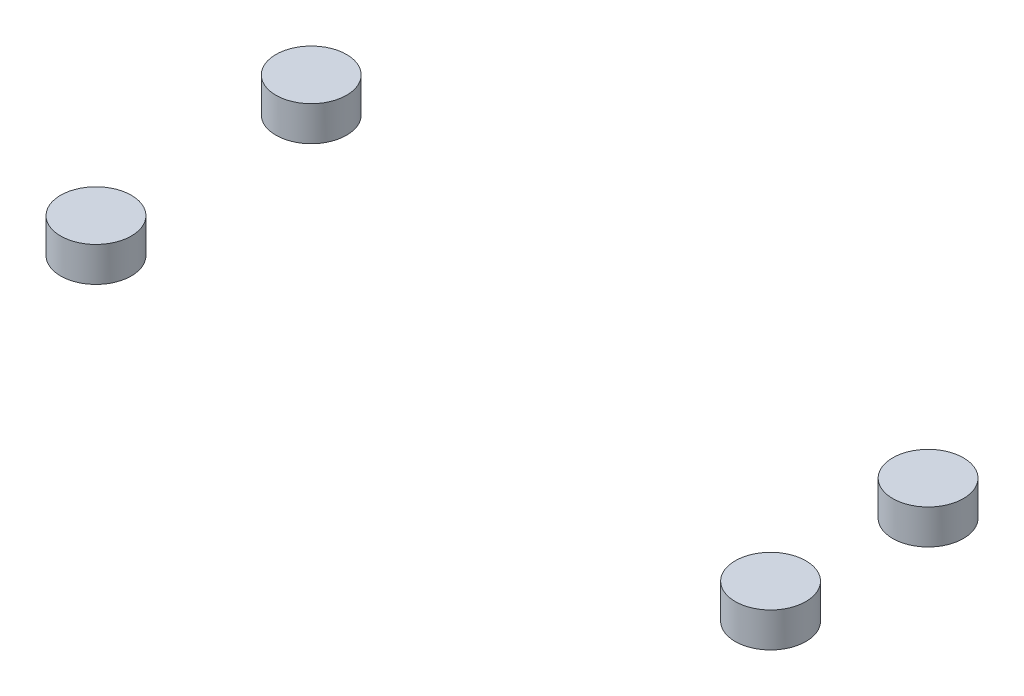
ISO-10303-21;
HEADER;
FILE_DESCRIPTION(('STEP AP214'),'2;1');
FILE_NAME('part.step','',(''),(''),'','','');
FILE_SCHEMA(('AUTOMOTIVE_DESIGN { 1 0 10303 214 1 1 1 1 }'));
ENDSEC;
DATA;
#1=APPLICATION_CONTEXT('core data for automotive mechanical design processes');
#2=APPLICATION_PROTOCOL_DEFINITION('international standard','automotive_design',2000,#1);
#3=PRODUCT_CONTEXT('',#1,'mechanical');
#4=PRODUCT('Part','Part','',(#3));
#5=PRODUCT_RELATED_PRODUCT_CATEGORY('part','',(#4));
#6=PRODUCT_DEFINITION_FORMATION('','',#4);
#7=PRODUCT_DEFINITION_CONTEXT('part definition',#1,'design');
#8=PRODUCT_DEFINITION('design','',#6,#7);
#9=PRODUCT_DEFINITION_SHAPE('','',#8);
#10=(LENGTH_UNIT() NAMED_UNIT(*) SI_UNIT(.MILLI.,.METRE.));
#11=(NAMED_UNIT(*) PLANE_ANGLE_UNIT() SI_UNIT($,.RADIAN.));
#12=(NAMED_UNIT(*) SI_UNIT($,.STERADIAN.) SOLID_ANGLE_UNIT());
#13=UNCERTAINTY_MEASURE_WITH_UNIT(LENGTH_MEASURE(1.E-05),#10,'distance_accuracy_value','');
#14=(GEOMETRIC_REPRESENTATION_CONTEXT(3) GLOBAL_UNCERTAINTY_ASSIGNED_CONTEXT((#13)) GLOBAL_UNIT_ASSIGNED_CONTEXT((#10,
#11,#12)) REPRESENTATION_CONTEXT('',''));
#15=CARTESIAN_POINT('',(0.,0.,0.));
#16=DIRECTION('',(0.,0.,1.));
#17=DIRECTION('',(1.,0.,0.));
#18=AXIS2_PLACEMENT_3D('',#15,#16,#17);
#19=CARTESIAN_POINT('',(-75.3231493812435,0.,20.6520537521322));
#20=DIRECTION('',(0.,1.,0.));
#21=DIRECTION('',(0.,0.,1.));
#22=AXIS2_PLACEMENT_3D('',#19,#20,#21);
#23=PLANE('',#22);
#24=CARTESIAN_POINT('',(-75.3231493812435,0.,20.6520537521322));
#25=DIRECTION('',(0.,1.,0.));
#26=DIRECTION('',(0.,0.,1.));
#27=AXIS2_PLACEMENT_3D('',#24,#25,#26);
#28=CIRCLE('',#27,8.00100000000002);
#29=CARTESIAN_POINT('',(-75.3231493812435,0.,28.6530537521322));
#30=VERTEX_POINT('',#29);
#31=EDGE_CURVE('E48',#30,#30,#28,.T.);
#32=ORIENTED_EDGE('',*,*,#31,.F.);
#33=EDGE_LOOP('',(#32));
#34=FACE_BOUND('',#33,.T.);
#35=ADVANCED_FACE('F41',(#34),#23,.F.);
#36=CARTESIAN_POINT('',(-75.3231493812435,30.4788454250945,20.6520537521322));
#37=DIRECTION('',(0.,-1.,0.));
#38=DIRECTION('',(0.,0.,-1.));
#39=AXIS2_PLACEMENT_3D('',#36,#37,#38);
#40=CYLINDRICAL_SURFACE('',#39,8.00100000000002);
#41=CARTESIAN_POINT('',(-75.3231493812435,7.84860000000016,20.6520537521322));
#42=DIRECTION('',(0.,-1.,0.));
#43=DIRECTION('',(0.,0.,-1.));
#44=AXIS2_PLACEMENT_3D('',#41,#42,#43);
#45=CIRCLE('',#44,8.00100000000002);
#46=CARTESIAN_POINT('',(-75.3231493812435,7.84860000000016,12.6510537521322));
#47=VERTEX_POINT('',#46);
#48=EDGE_CURVE('E11',#47,#47,#45,.T.);
#49=ORIENTED_EDGE('',*,*,#48,.T.);
#50=EDGE_LOOP('',(#49));
#51=FACE_BOUND('',#50,.T.);
#52=ORIENTED_EDGE('',*,*,#31,.T.);
#53=EDGE_LOOP('',(#52));
#54=FACE_BOUND('',#53,.T.);
#55=ADVANCED_FACE('F43',(#51,#54),#40,.T.);
#56=CARTESIAN_POINT('',(-75.3231493812435,7.84860000000015,20.6520537521322));
#57=DIRECTION('',(0.,-1.,0.));
#58=DIRECTION('',(0.0620018093914848,0.,0.998076036999277));
#59=AXIS2_PLACEMENT_3D('',#56,#57,#58);
#60=PLANE('',#59);
#61=ORIENTED_EDGE('',*,*,#48,.F.);
#62=EDGE_LOOP('',(#61));
#63=FACE_BOUND('',#62,.T.);
#64=ADVANCED_FACE('F59',(#63),#60,.F.);
#65=CLOSED_SHELL('',(#35,#55,#64));
#66=MANIFOLD_SOLID_BREP('B2',#65);
#67=CARTESIAN_POINT('',(-78.5516548533607,0.,-31.3189125578204));
#68=DIRECTION('',(0.,1.,0.));
#69=DIRECTION('',(0.,0.,1.));
#70=AXIS2_PLACEMENT_3D('',#67,#68,#69);
#71=PLANE('',#70);
#72=CARTESIAN_POINT('',(-78.5516548533607,0.,-31.3189125578204));
#73=DIRECTION('',(0.,1.,0.));
#74=DIRECTION('',(0.,0.,1.));
#75=AXIS2_PLACEMENT_3D('',#72,#73,#74);
#76=CIRCLE('',#75,8.00099999999999);
#77=CARTESIAN_POINT('',(-78.5516548533607,0.,-23.3179125578204));
#78=VERTEX_POINT('',#77);
#79=EDGE_CURVE('E96',#78,#78,#76,.T.);
#80=ORIENTED_EDGE('',*,*,#79,.F.);
#81=EDGE_LOOP('',(#80));
#82=FACE_BOUND('',#81,.T.);
#83=ADVANCED_FACE('F89',(#82),#71,.F.);
#84=CARTESIAN_POINT('',(-78.5516548533607,30.4788454250945,-31.3189125578204));
#85=DIRECTION('',(0.,-1.,0.));
#86=DIRECTION('',(0.,0.,-1.));
#87=AXIS2_PLACEMENT_3D('',#84,#85,#86);
#88=CYLINDRICAL_SURFACE('',#87,8.00099999999999);
#89=CARTESIAN_POINT('',(-78.5516548533607,7.84860000000016,-31.3189125578204));
#90=DIRECTION('',(0.,-1.,0.));
#91=DIRECTION('',(0.,0.,-1.));
#92=AXIS2_PLACEMENT_3D('',#89,#90,#91);
#93=CIRCLE('',#92,8.00099999999999);
#94=CARTESIAN_POINT('',(-78.5516548533607,7.84860000000016,-39.3199125578204));
#95=VERTEX_POINT('',#94);
#96=EDGE_CURVE('E40',#95,#95,#93,.T.);
#97=ORIENTED_EDGE('',*,*,#96,.T.);
#98=EDGE_LOOP('',(#97));
#99=FACE_BOUND('',#98,.T.);
#100=ORIENTED_EDGE('',*,*,#79,.T.);
#101=EDGE_LOOP('',(#100));
#102=FACE_BOUND('',#101,.T.);
#103=ADVANCED_FACE('F91',(#99,#102),#88,.T.);
#104=CARTESIAN_POINT('',(-75.3231493812435,7.84860000000015,20.6520537521322));
#105=DIRECTION('',(0.,-1.,0.));
#106=DIRECTION('',(0.0620018093914848,0.,0.998076036999277));
#107=AXIS2_PLACEMENT_3D('',#104,#105,#106);
#108=PLANE('',#107);
#109=ORIENTED_EDGE('',*,*,#96,.F.);
#110=EDGE_LOOP('',(#109));
#111=FACE_BOUND('',#110,.T.);
#112=ADVANCED_FACE('F107',(#111),#108,.F.);
#113=CLOSED_SHELL('',(#83,#103,#112));
#114=MANIFOLD_SOLID_BREP('B6',#113);
#115=CARTESIAN_POINT('',(72.7273490854409,0.,15.9595259459327));
#116=DIRECTION('',(0.,1.,0.));
#117=DIRECTION('',(0.,0.,1.));
#118=AXIS2_PLACEMENT_3D('',#115,#116,#117);
#119=PLANE('',#118);
#120=CARTESIAN_POINT('',(72.7273490854409,0.,15.9595259459327));
#121=DIRECTION('',(0.,1.,0.));
#122=DIRECTION('',(0.,0.,1.));
#123=AXIS2_PLACEMENT_3D('',#120,#121,#122);
#124=CIRCLE('',#123,8.00099999999997);
#125=CARTESIAN_POINT('',(72.7273490854409,0.,23.9605259459327));
#126=VERTEX_POINT('',#125);
#127=EDGE_CURVE('E145',#126,#126,#124,.T.);
#128=ORIENTED_EDGE('',*,*,#127,.F.);
#129=EDGE_LOOP('',(#128));
#130=FACE_BOUND('',#129,.T.);
#131=ADVANCED_FACE('F138',(#130),#119,.F.);
#132=CARTESIAN_POINT('',(72.7273490854409,30.4788454250945,15.9595259459327));
#133=DIRECTION('',(0.,-1.,0.));
#134=DIRECTION('',(0.,0.,-1.));
#135=AXIS2_PLACEMENT_3D('',#132,#133,#134);
#136=CYLINDRICAL_SURFACE('',#135,8.00099999999997);
#137=CARTESIAN_POINT('',(72.7273490854409,7.84860000000016,15.9595259459327));
#138=DIRECTION('',(0.,-1.,0.));
#139=DIRECTION('',(0.,0.,-1.));
#140=AXIS2_PLACEMENT_3D('',#137,#138,#139);
#141=CIRCLE('',#140,8.00099999999997);
#142=CARTESIAN_POINT('',(72.7273490854409,7.84860000000016,7.95852594593274));
#143=VERTEX_POINT('',#142);
#144=EDGE_CURVE('E88',#143,#143,#141,.T.);
#145=ORIENTED_EDGE('',*,*,#144,.T.);
#146=EDGE_LOOP('',(#145));
#147=FACE_BOUND('',#146,.T.);
#148=ORIENTED_EDGE('',*,*,#127,.T.);
#149=EDGE_LOOP('',(#148));
#150=FACE_BOUND('',#149,.T.);
#151=ADVANCED_FACE('F140',(#147,#150),#136,.T.);
#152=CARTESIAN_POINT('',(-75.3231493812435,7.84860000000015,20.6520537521322));
#153=DIRECTION('',(0.,-1.,0.));
#154=DIRECTION('',(0.0620018093914848,0.,0.998076036999277));
#155=AXIS2_PLACEMENT_3D('',#152,#153,#154);
#156=PLANE('',#155);
#157=ORIENTED_EDGE('',*,*,#144,.F.);
#158=EDGE_LOOP('',(#157));
#159=FACE_BOUND('',#158,.T.);
#160=ADVANCED_FACE('F156',(#159),#156,.F.);
#161=CLOSED_SHELL('',(#131,#151,#160));
#162=MANIFOLD_SOLID_BREP('B35',#161);
#163=CARTESIAN_POINT('',(70.3650280082865,0.,-22.0680103783486));
#164=DIRECTION('',(0.,1.,0.));
#165=DIRECTION('',(0.,0.,1.));
#166=AXIS2_PLACEMENT_3D('',#163,#164,#165);
#167=PLANE('',#166);
#168=CARTESIAN_POINT('',(70.3650280082865,0.,-22.0680103783486));
#169=DIRECTION('',(0.,1.,0.));
#170=DIRECTION('',(0.,0.,1.));
#171=AXIS2_PLACEMENT_3D('',#168,#169,#170);
#172=CIRCLE('',#171,8.00100000000002);
#173=CARTESIAN_POINT('',(70.3650280082865,0.,-14.0670103783486));
#174=VERTEX_POINT('',#173);
#175=EDGE_CURVE('E191',#174,#174,#172,.T.);
#176=ORIENTED_EDGE('',*,*,#175,.F.);
#177=EDGE_LOOP('',(#176));
#178=FACE_BOUND('',#177,.T.);
#179=ADVANCED_FACE('F184',(#178),#167,.F.);
#180=CARTESIAN_POINT('',(70.3650280082865,30.4788454250945,-22.0680103783486));
#181=DIRECTION('',(0.,-1.,0.));
#182=DIRECTION('',(0.,0.,-1.));
#183=AXIS2_PLACEMENT_3D('',#180,#181,#182);
#184=CYLINDRICAL_SURFACE('',#183,8.00100000000002);
#185=CARTESIAN_POINT('',(70.3650280082865,7.84860000000016,-22.0680103783486));
#186=DIRECTION('',(0.,-1.,0.));
#187=DIRECTION('',(0.,0.,-1.));
#188=AXIS2_PLACEMENT_3D('',#185,#186,#187);
#189=CIRCLE('',#188,8.00100000000002);
#190=CARTESIAN_POINT('',(70.3650280082865,7.84860000000016,-30.0690103783486));
#191=VERTEX_POINT('',#190);
#192=EDGE_CURVE('E137',#191,#191,#189,.T.);
#193=ORIENTED_EDGE('',*,*,#192,.T.);
#194=EDGE_LOOP('',(#193));
#195=FACE_BOUND('',#194,.T.);
#196=ORIENTED_EDGE('',*,*,#175,.T.);
#197=EDGE_LOOP('',(#196));
#198=FACE_BOUND('',#197,.T.);
#199=ADVANCED_FACE('F186',(#195,#198),#184,.T.);
#200=CARTESIAN_POINT('',(-75.3231493812435,7.84860000000015,20.6520537521322));
#201=DIRECTION('',(0.,-1.,0.));
#202=DIRECTION('',(0.0620018093914848,0.,0.998076036999277));
#203=AXIS2_PLACEMENT_3D('',#200,#201,#202);
#204=PLANE('',#203);
#205=ORIENTED_EDGE('',*,*,#192,.F.);
#206=EDGE_LOOP('',(#205));
#207=FACE_BOUND('',#206,.T.);
#208=ADVANCED_FACE('F202',(#207),#204,.F.);
#209=CLOSED_SHELL('',(#179,#199,#208));
#210=MANIFOLD_SOLID_BREP('B83',#209);
#211=ADVANCED_BREP_SHAPE_REPRESENTATION('',(#18,#66,#114,#162,#210),#14);
#212=SHAPE_DEFINITION_REPRESENTATION(#9,#211);
ENDSEC;
END-ISO-10303-21;
